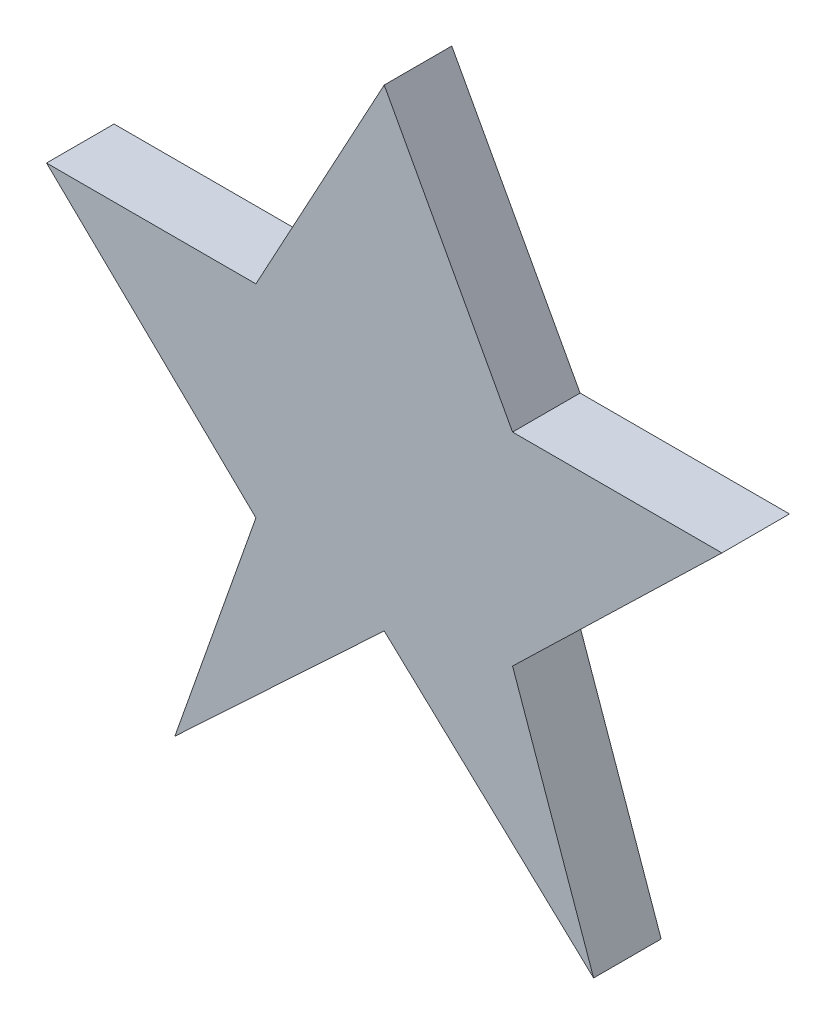
ISO-10303-21;
HEADER;
FILE_DESCRIPTION(('STEP AP214'),'2;1');
FILE_NAME('part.step','',(''),(''),'','','');
FILE_SCHEMA(('AUTOMOTIVE_DESIGN { 1 0 10303 214 1 1 1 1 }'));
ENDSEC;
DATA;
#1=APPLICATION_CONTEXT('core data for automotive mechanical design processes');
#2=APPLICATION_PROTOCOL_DEFINITION('international standard','automotive_design',2000,#1);
#3=PRODUCT_CONTEXT('',#1,'mechanical');
#4=PRODUCT('Part','Part','',(#3));
#5=PRODUCT_RELATED_PRODUCT_CATEGORY('part','',(#4));
#6=PRODUCT_DEFINITION_FORMATION('','',#4);
#7=PRODUCT_DEFINITION_CONTEXT('part definition',#1,'design');
#8=PRODUCT_DEFINITION('design','',#6,#7);
#9=PRODUCT_DEFINITION_SHAPE('','',#8);
#10=(LENGTH_UNIT() NAMED_UNIT(*) SI_UNIT(.MILLI.,.METRE.));
#11=(NAMED_UNIT(*) PLANE_ANGLE_UNIT() SI_UNIT($,.RADIAN.));
#12=(NAMED_UNIT(*) SI_UNIT($,.STERADIAN.) SOLID_ANGLE_UNIT());
#13=UNCERTAINTY_MEASURE_WITH_UNIT(LENGTH_MEASURE(1.E-05),#10,'distance_accuracy_value','');
#14=(GEOMETRIC_REPRESENTATION_CONTEXT(3) GLOBAL_UNCERTAINTY_ASSIGNED_CONTEXT((#13)) GLOBAL_UNIT_ASSIGNED_CONTEXT((#10,
#11,#12)) REPRESENTATION_CONTEXT('',''));
#15=CARTESIAN_POINT('',(0.,0.,0.));
#16=DIRECTION('',(0.,0.,1.));
#17=DIRECTION('',(1.,0.,0.));
#18=AXIS2_PLACEMENT_3D('',#15,#16,#17);
#19=CARTESIAN_POINT('',(-190.,150.,100.));
#20=DIRECTION('',(0.878853431665694,-0.477091862904234,0.));
#21=DIRECTION('',(0.477091862904234,0.878853431665694,0.));
#22=AXIS2_PLACEMENT_3D('',#19,#20,#21);
#23=PLANE('',#22);
#24=DIRECTION('',(-0.477091862904234,-0.878853431665694,0.));
#25=VECTOR('',#24,1.);
#26=CARTESIAN_POINT('',(-190.,150.,0.));
#27=LINE('',#26,#25);
#28=CARTESIAN_POINT('',(0.,500.,0.));
#29=VERTEX_POINT('',#28);
#30=CARTESIAN_POINT('',(-190.,150.,0.));
#31=VERTEX_POINT('',#30);
#32=EDGE_CURVE('E149',#29,#31,#27,.T.);
#33=ORIENTED_EDGE('',*,*,#32,.T.);
#34=DIRECTION('',(0.,0.,-1.));
#35=VECTOR('',#34,1.);
#36=CARTESIAN_POINT('',(-190.,150.,100.));
#37=LINE('',#36,#35);
#38=CARTESIAN_POINT('',(-190.,150.,100.));
#39=VERTEX_POINT('',#38);
#40=EDGE_CURVE('E11',#39,#31,#37,.T.);
#41=ORIENTED_EDGE('',*,*,#40,.F.);
#42=DIRECTION('',(-0.477091862904234,-0.878853431665694,0.));
#43=VECTOR('',#42,1.);
#44=CARTESIAN_POINT('',(-190.,150.,100.));
#45=LINE('',#44,#43);
#46=CARTESIAN_POINT('',(0.,500.,100.));
#47=VERTEX_POINT('',#46);
#48=EDGE_CURVE('E167',#47,#39,#45,.T.);
#49=ORIENTED_EDGE('',*,*,#48,.F.);
#50=DIRECTION('',(0.,0.,-1.));
#51=VECTOR('',#50,1.);
#52=CARTESIAN_POINT('',(0.,500.,100.));
#53=LINE('',#52,#51);
#54=EDGE_CURVE('E145',#47,#29,#53,.T.);
#55=ORIENTED_EDGE('',*,*,#54,.T.);
#56=EDGE_LOOP('',(#33,#41,#49,#55));
#57=FACE_BOUND('',#56,.T.);
#58=ADVANCED_FACE('F41',(#57),#23,.F.);
#59=CARTESIAN_POINT('',(-500.,150.,100.));
#60=DIRECTION('',(0.,-1.,0.));
#61=DIRECTION('',(0.,0.,-1.));
#62=AXIS2_PLACEMENT_3D('',#59,#60,#61);
#63=PLANE('',#62);
#64=DIRECTION('',(-1.,0.,0.));
#65=VECTOR('',#64,1.);
#66=CARTESIAN_POINT('',(-500.,150.,0.));
#67=LINE('',#66,#65);
#68=CARTESIAN_POINT('',(-500.,150.,0.));
#69=VERTEX_POINT('',#68);
#70=EDGE_CURVE('E152',#31,#69,#67,.T.);
#71=ORIENTED_EDGE('',*,*,#70,.T.);
#72=DIRECTION('',(0.,0.,-1.));
#73=VECTOR('',#72,1.);
#74=CARTESIAN_POINT('',(-500.,150.,100.));
#75=LINE('',#74,#73);
#76=CARTESIAN_POINT('',(-500.,150.,100.));
#77=VERTEX_POINT('',#76);
#78=EDGE_CURVE('E49',#77,#69,#75,.T.);
#79=ORIENTED_EDGE('',*,*,#78,.F.);
#80=DIRECTION('',(-1.,0.,0.));
#81=VECTOR('',#80,1.);
#82=CARTESIAN_POINT('',(-500.,150.,100.));
#83=LINE('',#82,#81);
#84=EDGE_CURVE('E106',#39,#77,#83,.T.);
#85=ORIENTED_EDGE('',*,*,#84,.F.);
#86=ORIENTED_EDGE('',*,*,#40,.T.);
#87=EDGE_LOOP('',(#71,#79,#85,#86));
#88=FACE_BOUND('',#87,.T.);
#89=ADVANCED_FACE('F216',(#88),#63,.F.);
#90=CARTESIAN_POINT('',(-190.,-150.,100.));
#91=DIRECTION('',(0.695421427516056,0.718602141766591,0.));
#92=DIRECTION('',(-0.718602141766591,0.695421427516056,0.));
#93=AXIS2_PLACEMENT_3D('',#90,#91,#92);
#94=PLANE('',#93);
#95=DIRECTION('',(0.718602141766591,-0.695421427516056,0.));
#96=VECTOR('',#95,1.);
#97=CARTESIAN_POINT('',(-190.,-150.,0.));
#98=LINE('',#97,#96);
#99=CARTESIAN_POINT('',(-190.,-150.,0.));
#100=VERTEX_POINT('',#99);
#101=EDGE_CURVE('E154',#69,#100,#98,.T.);
#102=ORIENTED_EDGE('',*,*,#101,.T.);
#103=DIRECTION('',(0.,0.,-1.));
#104=VECTOR('',#103,1.);
#105=CARTESIAN_POINT('',(-190.,-150.,100.));
#106=LINE('',#105,#104);
#107=CARTESIAN_POINT('',(-190.,-150.,100.));
#108=VERTEX_POINT('',#107);
#109=EDGE_CURVE('E180',#108,#100,#106,.T.);
#110=ORIENTED_EDGE('',*,*,#109,.F.);
#111=DIRECTION('',(0.718602141766591,-0.695421427516056,0.));
#112=VECTOR('',#111,1.);
#113=CARTESIAN_POINT('',(-190.,-150.,100.));
#114=LINE('',#113,#112);
#115=EDGE_CURVE('E188',#77,#108,#114,.T.);
#116=ORIENTED_EDGE('',*,*,#115,.F.);
#117=ORIENTED_EDGE('',*,*,#78,.T.);
#118=EDGE_LOOP('',(#102,#110,#116,#117));
#119=FACE_BOUND('',#118,.T.);
#120=ADVANCED_FACE('F186',(#119),#94,.F.);
#121=CARTESIAN_POINT('',(-310.,-490.,100.));
#122=DIRECTION('',(0.94299033358289,-0.332820117735137,0.));
#123=DIRECTION('',(0.332820117735137,0.94299033358289,0.));
#124=AXIS2_PLACEMENT_3D('',#121,#122,#123);
#125=PLANE('',#124);
#126=DIRECTION('',(-0.332820117735137,-0.94299033358289,0.));
#127=VECTOR('',#126,1.);
#128=CARTESIAN_POINT('',(-310.,-490.,0.));
#129=LINE('',#128,#127);
#130=CARTESIAN_POINT('',(-310.,-490.,0.));
#131=VERTEX_POINT('',#130);
#132=EDGE_CURVE('E156',#100,#131,#129,.T.);
#133=ORIENTED_EDGE('',*,*,#132,.T.);
#134=DIRECTION('',(0.,0.,-1.));
#135=VECTOR('',#134,1.);
#136=CARTESIAN_POINT('',(-310.,-490.,100.));
#137=LINE('',#136,#135);
#138=CARTESIAN_POINT('',(-310.,-490.,100.));
#139=VERTEX_POINT('',#138);
#140=EDGE_CURVE('E177',#139,#131,#137,.T.);
#141=ORIENTED_EDGE('',*,*,#140,.F.);
#142=DIRECTION('',(-0.332820117735137,-0.94299033358289,0.));
#143=VECTOR('',#142,1.);
#144=CARTESIAN_POINT('',(-310.,-490.,100.));
#145=LINE('',#144,#143);
#146=EDGE_CURVE('E206',#108,#139,#145,.T.);
#147=ORIENTED_EDGE('',*,*,#146,.F.);
#148=ORIENTED_EDGE('',*,*,#109,.T.);
#149=EDGE_LOOP('',(#133,#141,#147,#148));
#150=FACE_BOUND('',#149,.T.);
#151=ADVANCED_FACE('F197',(#150),#125,.F.);
#152=CARTESIAN_POINT('',(0.,-200.,100.));
#153=DIRECTION('',(-0.683157128775741,0.730271413518896,0.));
#154=DIRECTION('',(-0.730271413518896,-0.683157128775741,0.));
#155=AXIS2_PLACEMENT_3D('',#152,#153,#154);
#156=PLANE('',#155);
#157=DIRECTION('',(0.730271413518896,0.683157128775741,0.));
#158=VECTOR('',#157,1.);
#159=CARTESIAN_POINT('',(0.,-200.,0.));
#160=LINE('',#159,#158);
#161=CARTESIAN_POINT('',(0.,-200.,0.));
#162=VERTEX_POINT('',#161);
#163=EDGE_CURVE('E158',#131,#162,#160,.T.);
#164=ORIENTED_EDGE('',*,*,#163,.T.);
#165=DIRECTION('',(0.,0.,-1.));
#166=VECTOR('',#165,1.);
#167=CARTESIAN_POINT('',(0.,-200.,100.));
#168=LINE('',#167,#166);
#169=CARTESIAN_POINT('',(0.,-200.,100.));
#170=VERTEX_POINT('',#169);
#171=EDGE_CURVE('E174',#170,#162,#168,.T.);
#172=ORIENTED_EDGE('',*,*,#171,.F.);
#173=DIRECTION('',(0.730271413518896,0.683157128775741,0.));
#174=VECTOR('',#173,1.);
#175=CARTESIAN_POINT('',(0.,-200.,100.));
#176=LINE('',#175,#174);
#177=EDGE_CURVE('E203',#139,#170,#176,.T.);
#178=ORIENTED_EDGE('',*,*,#177,.F.);
#179=ORIENTED_EDGE('',*,*,#140,.T.);
#180=EDGE_LOOP('',(#164,#172,#178,#179));
#181=FACE_BOUND('',#180,.T.);
#182=ADVANCED_FACE('F201',(#181),#156,.F.);
#183=CARTESIAN_POINT('',(310.,-490.,100.));
#184=DIRECTION('',(0.683157128775741,0.730271413518896,0.));
#185=DIRECTION('',(-0.730271413518896,0.683157128775741,0.));
#186=AXIS2_PLACEMENT_3D('',#183,#184,#185);
#187=PLANE('',#186);
#188=DIRECTION('',(0.730271413518896,-0.683157128775741,0.));
#189=VECTOR('',#188,1.);
#190=CARTESIAN_POINT('',(310.,-490.,0.));
#191=LINE('',#190,#189);
#192=CARTESIAN_POINT('',(310.,-490.,0.));
#193=VERTEX_POINT('',#192);
#194=EDGE_CURVE('E160',#162,#193,#191,.T.);
#195=ORIENTED_EDGE('',*,*,#194,.T.);
#196=DIRECTION('',(0.,0.,-1.));
#197=VECTOR('',#196,1.);
#198=CARTESIAN_POINT('',(310.,-490.,100.));
#199=LINE('',#198,#197);
#200=CARTESIAN_POINT('',(310.,-490.,100.));
#201=VERTEX_POINT('',#200);
#202=EDGE_CURVE('E171',#201,#193,#199,.T.);
#203=ORIENTED_EDGE('',*,*,#202,.F.);
#204=DIRECTION('',(0.730271413518896,-0.683157128775741,0.));
#205=VECTOR('',#204,1.);
#206=CARTESIAN_POINT('',(310.,-490.,100.));
#207=LINE('',#206,#205);
#208=EDGE_CURVE('E205',#170,#201,#207,.T.);
#209=ORIENTED_EDGE('',*,*,#208,.F.);
#210=ORIENTED_EDGE('',*,*,#171,.T.);
#211=EDGE_LOOP('',(#195,#203,#209,#210));
#212=FACE_BOUND('',#211,.T.);
#213=ADVANCED_FACE('F228',(#212),#187,.F.);
#214=CARTESIAN_POINT('',(190.,-150.,100.));
#215=DIRECTION('',(-0.94299033358289,-0.332820117735137,0.));
#216=DIRECTION('',(0.332820117735137,-0.94299033358289,0.));
#217=AXIS2_PLACEMENT_3D('',#214,#215,#216);
#218=PLANE('',#217);
#219=DIRECTION('',(-0.332820117735137,0.94299033358289,0.));
#220=VECTOR('',#219,1.);
#221=CARTESIAN_POINT('',(190.,-150.,0.));
#222=LINE('',#221,#220);
#223=CARTESIAN_POINT('',(190.,-150.,0.));
#224=VERTEX_POINT('',#223);
#225=EDGE_CURVE('E162',#193,#224,#222,.T.);
#226=ORIENTED_EDGE('',*,*,#225,.T.);
#227=DIRECTION('',(0.,0.,-1.));
#228=VECTOR('',#227,1.);
#229=CARTESIAN_POINT('',(190.,-150.,100.));
#230=LINE('',#229,#228);
#231=CARTESIAN_POINT('',(190.,-150.,100.));
#232=VERTEX_POINT('',#231);
#233=EDGE_CURVE('E140',#232,#224,#230,.T.);
#234=ORIENTED_EDGE('',*,*,#233,.F.);
#235=DIRECTION('',(-0.332820117735137,0.94299033358289,0.));
#236=VECTOR('',#235,1.);
#237=CARTESIAN_POINT('',(190.,-150.,100.));
#238=LINE('',#237,#236);
#239=EDGE_CURVE('E131',#201,#232,#238,.T.);
#240=ORIENTED_EDGE('',*,*,#239,.F.);
#241=ORIENTED_EDGE('',*,*,#202,.T.);
#242=EDGE_LOOP('',(#226,#234,#240,#241));
#243=FACE_BOUND('',#242,.T.);
#244=ADVANCED_FACE('F231',(#243),#218,.F.);
#245=CARTESIAN_POINT('',(500.,150.,100.));
#246=DIRECTION('',(-0.695421427516056,0.718602141766591,0.));
#247=DIRECTION('',(-0.718602141766591,-0.695421427516056,0.));
#248=AXIS2_PLACEMENT_3D('',#245,#246,#247);
#249=PLANE('',#248);
#250=DIRECTION('',(0.718602141766591,0.695421427516056,0.));
#251=VECTOR('',#250,1.);
#252=CARTESIAN_POINT('',(500.,150.,0.));
#253=LINE('',#252,#251);
#254=CARTESIAN_POINT('',(500.,150.,0.));
#255=VERTEX_POINT('',#254);
#256=EDGE_CURVE('E139',#224,#255,#253,.T.);
#257=ORIENTED_EDGE('',*,*,#256,.T.);
#258=DIRECTION('',(0.,0.,-1.));
#259=VECTOR('',#258,1.);
#260=CARTESIAN_POINT('',(500.,150.,100.));
#261=LINE('',#260,#259);
#262=CARTESIAN_POINT('',(500.,150.,100.));
#263=VERTEX_POINT('',#262);
#264=EDGE_CURVE('E136',#263,#255,#261,.T.);
#265=ORIENTED_EDGE('',*,*,#264,.F.);
#266=DIRECTION('',(0.718602141766591,0.695421427516056,0.));
#267=VECTOR('',#266,1.);
#268=CARTESIAN_POINT('',(500.,150.,100.));
#269=LINE('',#268,#267);
#270=EDGE_CURVE('E125',#232,#263,#269,.T.);
#271=ORIENTED_EDGE('',*,*,#270,.F.);
#272=ORIENTED_EDGE('',*,*,#233,.T.);
#273=EDGE_LOOP('',(#257,#265,#271,#272));
#274=FACE_BOUND('',#273,.T.);
#275=ADVANCED_FACE('F137',(#274),#249,.F.);
#276=CARTESIAN_POINT('',(190.,150.,100.));
#277=DIRECTION('',(0.,-1.,0.));
#278=DIRECTION('',(0.,0.,-1.));
#279=AXIS2_PLACEMENT_3D('',#276,#277,#278);
#280=PLANE('',#279);
#281=DIRECTION('',(-1.,0.,0.));
#282=VECTOR('',#281,1.);
#283=CARTESIAN_POINT('',(190.,150.,0.));
#284=LINE('',#283,#282);
#285=CARTESIAN_POINT('',(190.,150.,0.));
#286=VERTEX_POINT('',#285);
#287=EDGE_CURVE('E92',#255,#286,#284,.T.);
#288=ORIENTED_EDGE('',*,*,#287,.T.);
#289=DIRECTION('',(0.,0.,-1.));
#290=VECTOR('',#289,1.);
#291=CARTESIAN_POINT('',(190.,150.,100.));
#292=LINE('',#291,#290);
#293=CARTESIAN_POINT('',(190.,150.,100.));
#294=VERTEX_POINT('',#293);
#295=EDGE_CURVE('E141',#294,#286,#292,.T.);
#296=ORIENTED_EDGE('',*,*,#295,.F.);
#297=DIRECTION('',(-1.,0.,0.));
#298=VECTOR('',#297,1.);
#299=CARTESIAN_POINT('',(190.,150.,100.));
#300=LINE('',#299,#298);
#301=EDGE_CURVE('E129',#263,#294,#300,.T.);
#302=ORIENTED_EDGE('',*,*,#301,.F.);
#303=ORIENTED_EDGE('',*,*,#264,.T.);
#304=EDGE_LOOP('',(#288,#296,#302,#303));
#305=FACE_BOUND('',#304,.T.);
#306=ADVANCED_FACE('F143',(#305),#280,.F.);
#307=CARTESIAN_POINT('',(0.,500.,100.));
#308=DIRECTION('',(-0.878853431665694,-0.477091862904234,0.));
#309=DIRECTION('',(0.477091862904234,-0.878853431665694,0.));
#310=AXIS2_PLACEMENT_3D('',#307,#308,#309);
#311=PLANE('',#310);
#312=DIRECTION('',(-0.477091862904234,0.878853431665694,0.));
#313=VECTOR('',#312,1.);
#314=CARTESIAN_POINT('',(0.,500.,0.));
#315=LINE('',#314,#313);
#316=EDGE_CURVE('E98',#286,#29,#315,.T.);
#317=ORIENTED_EDGE('',*,*,#316,.T.);
#318=ORIENTED_EDGE('',*,*,#54,.F.);
#319=DIRECTION('',(-0.477091862904234,0.878853431665694,0.));
#320=VECTOR('',#319,1.);
#321=CARTESIAN_POINT('',(0.,500.,100.));
#322=LINE('',#321,#320);
#323=EDGE_CURVE('E57',#294,#47,#322,.T.);
#324=ORIENTED_EDGE('',*,*,#323,.F.);
#325=ORIENTED_EDGE('',*,*,#295,.T.);
#326=EDGE_LOOP('',(#317,#318,#324,#325));
#327=FACE_BOUND('',#326,.T.);
#328=ADVANCED_FACE('F240',(#327),#311,.F.);
#329=CARTESIAN_POINT('',(0.,0.,100.));
#330=DIRECTION('',(0.,0.,1.));
#331=DIRECTION('',(1.,0.,0.));
#332=AXIS2_PLACEMENT_3D('',#329,#330,#331);
#333=PLANE('',#332);
#334=ORIENTED_EDGE('',*,*,#48,.T.);
#335=ORIENTED_EDGE('',*,*,#84,.T.);
#336=ORIENTED_EDGE('',*,*,#115,.T.);
#337=ORIENTED_EDGE('',*,*,#146,.T.);
#338=ORIENTED_EDGE('',*,*,#177,.T.);
#339=ORIENTED_EDGE('',*,*,#208,.T.);
#340=ORIENTED_EDGE('',*,*,#239,.T.);
#341=ORIENTED_EDGE('',*,*,#270,.T.);
#342=ORIENTED_EDGE('',*,*,#301,.T.);
#343=ORIENTED_EDGE('',*,*,#323,.T.);
#344=EDGE_LOOP('',(#334,#335,#336,#337,#338,#339,#340,#341,#342,#343));
#345=FACE_BOUND('',#344,.T.);
#346=ADVANCED_FACE('F127',(#345),#333,.T.);
#347=CARTESIAN_POINT('',(0.,0.,0.));
#348=DIRECTION('',(0.,0.,1.));
#349=DIRECTION('',(1.,0.,0.));
#350=AXIS2_PLACEMENT_3D('',#347,#348,#349);
#351=PLANE('',#350);
#352=ORIENTED_EDGE('',*,*,#32,.F.);
#353=ORIENTED_EDGE('',*,*,#316,.F.);
#354=ORIENTED_EDGE('',*,*,#287,.F.);
#355=ORIENTED_EDGE('',*,*,#256,.F.);
#356=ORIENTED_EDGE('',*,*,#225,.F.);
#357=ORIENTED_EDGE('',*,*,#194,.F.);
#358=ORIENTED_EDGE('',*,*,#163,.F.);
#359=ORIENTED_EDGE('',*,*,#132,.F.);
#360=ORIENTED_EDGE('',*,*,#101,.F.);
#361=ORIENTED_EDGE('',*,*,#70,.F.);
#362=EDGE_LOOP('',(#352,#353,#354,#355,#356,#357,#358,#359,#360,#361));
#363=FACE_BOUND('',#362,.T.);
#364=ADVANCED_FACE('F192',(#363),#351,.F.);
#365=CLOSED_SHELL('',(#58,#89,#120,#151,#182,#213,#244,#275,#306,#328,#346,#364));
#366=MANIFOLD_SOLID_BREP('B2',#365);
#367=ADVANCED_BREP_SHAPE_REPRESENTATION('',(#18,#366),#14);
#368=SHAPE_DEFINITION_REPRESENTATION(#9,#367);
ENDSEC;
END-ISO-10303-21;
